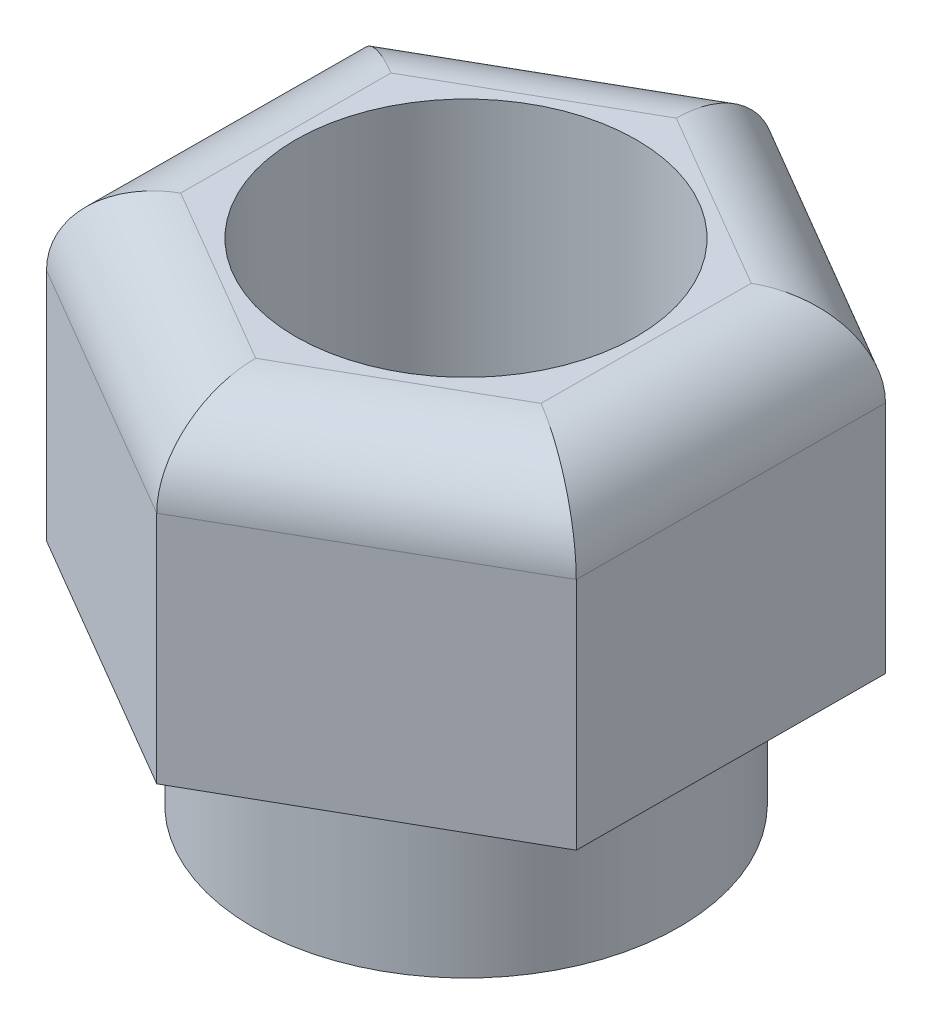
ISO-10303-21;
HEADER;
FILE_DESCRIPTION(('STEP AP214'),'2;1');
FILE_NAME('part.step','',(''),(''),'','','');
FILE_SCHEMA(('AUTOMOTIVE_DESIGN { 1 0 10303 214 1 1 1 1 }'));
ENDSEC;
DATA;
#1=APPLICATION_CONTEXT('core data for automotive mechanical design processes');
#2=APPLICATION_PROTOCOL_DEFINITION('international standard','automotive_design',2000,#1);
#3=PRODUCT_CONTEXT('',#1,'mechanical');
#4=PRODUCT('Part','Part','',(#3));
#5=PRODUCT_RELATED_PRODUCT_CATEGORY('part','',(#4));
#6=PRODUCT_DEFINITION_FORMATION('','',#4);
#7=PRODUCT_DEFINITION_CONTEXT('part definition',#1,'design');
#8=PRODUCT_DEFINITION('design','',#6,#7);
#9=PRODUCT_DEFINITION_SHAPE('','',#8);
#10=(LENGTH_UNIT() NAMED_UNIT(*) SI_UNIT(.MILLI.,.METRE.));
#11=(NAMED_UNIT(*) PLANE_ANGLE_UNIT() SI_UNIT($,.RADIAN.));
#12=(NAMED_UNIT(*) SI_UNIT($,.STERADIAN.) SOLID_ANGLE_UNIT());
#13=UNCERTAINTY_MEASURE_WITH_UNIT(LENGTH_MEASURE(1.E-05),#10,'distance_accuracy_value','');
#14=(GEOMETRIC_REPRESENTATION_CONTEXT(3) GLOBAL_UNCERTAINTY_ASSIGNED_CONTEXT((#13)) GLOBAL_UNIT_ASSIGNED_CONTEXT((#10,
#11,#12)) REPRESENTATION_CONTEXT('',''));
#15=CARTESIAN_POINT('',(0.,0.,0.));
#16=DIRECTION('',(0.,0.,1.));
#17=DIRECTION('',(1.,0.,0.));
#18=AXIS2_PLACEMENT_3D('',#15,#16,#17);
#19=CARTESIAN_POINT('',(0.,8.,0.));
#20=DIRECTION('',(0.,-1.,0.));
#21=DIRECTION('',(0.,0.,-1.));
#22=AXIS2_PLACEMENT_3D('',#19,#20,#21);
#23=CYLINDRICAL_SURFACE('',#22,10.);
#24=CARTESIAN_POINT('',(0.,8.,0.));
#25=DIRECTION('',(0.,1.,0.));
#26=DIRECTION('',(0.,0.,1.));
#27=AXIS2_PLACEMENT_3D('',#24,#25,#26);
#28=CIRCLE('',#27,10.);
#29=CARTESIAN_POINT('',(0.,8.,10.));
#30=VERTEX_POINT('',#29);
#31=EDGE_CURVE('E150',#30,#30,#28,.T.);
#32=ORIENTED_EDGE('',*,*,#31,.F.);
#33=EDGE_LOOP('',(#32));
#34=FACE_BOUND('',#33,.T.);
#35=CARTESIAN_POINT('',(0.,0.,0.));
#36=DIRECTION('',(0.,1.,0.));
#37=DIRECTION('',(0.,0.,1.));
#38=AXIS2_PLACEMENT_3D('',#35,#36,#37);
#39=CIRCLE('',#38,10.);
#40=CARTESIAN_POINT('',(0.,0.,10.));
#41=VERTEX_POINT('',#40);
#42=EDGE_CURVE('E110',#41,#41,#39,.T.);
#43=ORIENTED_EDGE('',*,*,#42,.T.);
#44=EDGE_LOOP('',(#43));
#45=FACE_BOUND('',#44,.T.);
#46=ADVANCED_FACE('F32',(#34,#45),#23,.T.);
#47=CARTESIAN_POINT('',(0.,0.,0.));
#48=DIRECTION('',(0.,1.,0.));
#49=DIRECTION('',(0.,0.,1.));
#50=AXIS2_PLACEMENT_3D('',#47,#48,#49);
#51=PLANE('',#50);
#52=CARTESIAN_POINT('',(0.,0.,0.));
#53=DIRECTION('',(0.,-1.,0.));
#54=DIRECTION('',(0.,0.,-1.));
#55=AXIS2_PLACEMENT_3D('',#52,#53,#54);
#56=CIRCLE('',#55,8.);
#57=CARTESIAN_POINT('',(0.,0.,-8.));
#58=VERTEX_POINT('',#57);
#59=EDGE_CURVE('E126',#58,#58,#56,.T.);
#60=ORIENTED_EDGE('',*,*,#59,.F.);
#61=EDGE_LOOP('',(#60));
#62=FACE_BOUND('',#61,.T.);
#63=ORIENTED_EDGE('',*,*,#42,.F.);
#64=EDGE_LOOP('',(#63));
#65=FACE_BOUND('',#64,.T.);
#66=ADVANCED_FACE('F207',(#62,#65),#51,.F.);
#67=CARTESIAN_POINT('',(-0.0794251265189853,23.,14.4335382004071));
#68=DIRECTION('',(-0.495226922330687,0.,-0.868763659114995));
#69=DIRECTION('',(-0.868763659114995,0.,0.495226922330687));
#70=AXIS2_PLACEMENT_3D('',#67,#68,#69);
#71=PLANE('',#70);
#72=DIRECTION('',(0.,-1.,0.));
#73=VECTOR('',#72,1.);
#74=CARTESIAN_POINT('',(12.4600981847862,23.,7.28555327746779));
#75=LINE('',#74,#73);
#76=CARTESIAN_POINT('',(12.4600981847862,19.,7.28555327746779));
#77=VERTEX_POINT('',#76);
#78=CARTESIAN_POINT('',(12.4600981847862,8.,7.28555327746779));
#79=VERTEX_POINT('',#78);
#80=EDGE_CURVE('E102',#77,#79,#75,.T.);
#81=ORIENTED_EDGE('',*,*,#80,.F.);
#82=DIRECTION('',(0.868763659114995,0.,-0.495226922330687));
#83=VECTOR('',#82,1.);
#84=CARTESIAN_POINT('',(-0.0794251265189874,19.,14.4335382004071));
#85=LINE('',#84,#83);
#86=CARTESIAN_POINT('',(-0.0794251265189853,19.,14.4335382004071));
#87=VERTEX_POINT('',#86);
#88=EDGE_CURVE('E11',#77,#87,#85,.F.);
#89=ORIENTED_EDGE('',*,*,#88,.T.);
#90=DIRECTION('',(0.,-1.,0.));
#91=VECTOR('',#90,1.);
#92=CARTESIAN_POINT('',(-0.0794251265189853,23.,14.4335382004071));
#93=LINE('',#92,#91);
#94=CARTESIAN_POINT('',(-0.0794251265189853,8.,14.4335382004071));
#95=VERTEX_POINT('',#94);
#96=EDGE_CURVE('E124',#87,#95,#93,.T.);
#97=ORIENTED_EDGE('',*,*,#96,.T.);
#98=DIRECTION('',(0.868763659114995,0.,-0.495226922330687));
#99=VECTOR('',#98,1.);
#100=CARTESIAN_POINT('',(-0.0794251265189853,8.,14.4335382004071));
#101=LINE('',#100,#99);
#102=EDGE_CURVE('E117',#95,#79,#101,.T.);
#103=ORIENTED_EDGE('',*,*,#102,.T.);
#104=EDGE_LOOP('',(#81,#89,#97,#103));
#105=FACE_BOUND('',#104,.T.);
#106=ADVANCED_FACE('F122',(#105),#71,.F.);
#107=CARTESIAN_POINT('',(12.4600981847862,23.,7.28555327746779));
#108=DIRECTION('',(-0.999984859843654,0.,-0.00550273418113889));
#109=DIRECTION('',(-0.00550273418113889,0.,0.999984859843654));
#110=AXIS2_PLACEMENT_3D('',#107,#108,#109);
#111=PLANE('',#110);
#112=DIRECTION('',(0.,-1.,0.));
#113=VECTOR('',#112,1.);
#114=CARTESIAN_POINT('',(12.5395233113052,23.,-7.14798492293931));
#115=LINE('',#114,#113);
#116=CARTESIAN_POINT('',(12.5395233113052,19.,-7.14798492293931));
#117=VERTEX_POINT('',#116);
#118=CARTESIAN_POINT('',(12.5395233113052,8.,-7.14798492293931));
#119=VERTEX_POINT('',#118);
#120=EDGE_CURVE('E111',#117,#119,#115,.T.);
#121=ORIENTED_EDGE('',*,*,#120,.F.);
#122=DIRECTION('',(0.00550273418113889,0.,-0.999984859843654));
#123=VECTOR('',#122,1.);
#124=CARTESIAN_POINT('',(12.4600981847862,19.,7.28555327746779));
#125=LINE('',#124,#123);
#126=EDGE_CURVE('E41',#117,#77,#125,.F.);
#127=ORIENTED_EDGE('',*,*,#126,.T.);
#128=ORIENTED_EDGE('',*,*,#80,.T.);
#129=DIRECTION('',(0.00550273418113889,0.,-0.999984859843654));
#130=VECTOR('',#129,1.);
#131=CARTESIAN_POINT('',(12.4600981847862,8.,7.28555327746779));
#132=LINE('',#131,#130);
#133=EDGE_CURVE('E105',#79,#119,#132,.T.);
#134=ORIENTED_EDGE('',*,*,#133,.T.);
#135=EDGE_LOOP('',(#121,#127,#128,#134));
#136=FACE_BOUND('',#135,.T.);
#137=ADVANCED_FACE('F104',(#136),#111,.F.);
#138=CARTESIAN_POINT('',(12.5395233113052,23.,-7.14798492293931));
#139=DIRECTION('',(-0.504757937512966,0.,0.863260924933856));
#140=DIRECTION('',(0.863260924933856,0.,0.504757937512966));
#141=AXIS2_PLACEMENT_3D('',#138,#139,#140);
#142=PLANE('',#141);
#143=DIRECTION('',(0.,-1.,0.));
#144=VECTOR('',#143,1.);
#145=CARTESIAN_POINT('',(0.0794251265189895,23.,-14.4335382004071));
#146=LINE('',#145,#144);
#147=CARTESIAN_POINT('',(0.0794251265189895,19.,-14.4335382004071));
#148=VERTEX_POINT('',#147);
#149=CARTESIAN_POINT('',(0.0794251265189895,8.,-14.4335382004071));
#150=VERTEX_POINT('',#149);
#151=EDGE_CURVE('E147',#148,#150,#146,.T.);
#152=ORIENTED_EDGE('',*,*,#151,.F.);
#153=DIRECTION('',(-0.863260924933856,0.,-0.504757937512966));
#154=VECTOR('',#153,1.);
#155=CARTESIAN_POINT('',(12.5395233113052,19.,-7.1479849229393));
#156=LINE('',#155,#154);
#157=EDGE_CURVE('E56',#148,#117,#156,.F.);
#158=ORIENTED_EDGE('',*,*,#157,.T.);
#159=ORIENTED_EDGE('',*,*,#120,.T.);
#160=DIRECTION('',(-0.863260924933856,0.,-0.504757937512966));
#161=VECTOR('',#160,1.);
#162=CARTESIAN_POINT('',(12.5395233113052,8.,-7.14798492293931));
#163=LINE('',#162,#161);
#164=EDGE_CURVE('E120',#119,#150,#163,.T.);
#165=ORIENTED_EDGE('',*,*,#164,.T.);
#166=EDGE_LOOP('',(#152,#158,#159,#165));
#167=FACE_BOUND('',#166,.T.);
#168=ADVANCED_FACE('F277',(#167),#142,.F.);
#169=CARTESIAN_POINT('',(0.0794251265189895,23.,-14.4335382004071));
#170=DIRECTION('',(0.495226922330687,0.,0.868763659114995));
#171=DIRECTION('',(0.868763659114995,0.,-0.495226922330687));
#172=AXIS2_PLACEMENT_3D('',#169,#170,#171);
#173=PLANE('',#172);
#174=DIRECTION('',(0.,-1.,0.));
#175=VECTOR('',#174,1.);
#176=CARTESIAN_POINT('',(-12.4600981847862,23.,-7.28555327746779));
#177=LINE('',#176,#175);
#178=CARTESIAN_POINT('',(-12.4600981847862,19.,-7.28555327746779));
#179=VERTEX_POINT('',#178);
#180=CARTESIAN_POINT('',(-12.4600981847862,8.,-7.28555327746779));
#181=VERTEX_POINT('',#180);
#182=EDGE_CURVE('E145',#179,#181,#177,.T.);
#183=ORIENTED_EDGE('',*,*,#182,.F.);
#184=DIRECTION('',(-0.868763659114995,0.,0.495226922330687));
#185=VECTOR('',#184,1.);
#186=CARTESIAN_POINT('',(0.0794251265189898,19.,-14.4335382004071));
#187=LINE('',#186,#185);
#188=EDGE_CURVE('E173',#179,#148,#187,.F.);
#189=ORIENTED_EDGE('',*,*,#188,.T.);
#190=ORIENTED_EDGE('',*,*,#151,.T.);
#191=DIRECTION('',(-0.868763659114995,0.,0.495226922330687));
#192=VECTOR('',#191,1.);
#193=CARTESIAN_POINT('',(0.0794251265189895,8.,-14.4335382004071));
#194=LINE('',#193,#192);
#195=EDGE_CURVE('E134',#150,#181,#194,.T.);
#196=ORIENTED_EDGE('',*,*,#195,.T.);
#197=EDGE_LOOP('',(#183,#189,#190,#196));
#198=FACE_BOUND('',#197,.T.);
#199=ADVANCED_FACE('F260',(#198),#173,.F.);
#200=CARTESIAN_POINT('',(-12.4600981847862,23.,-7.28555327746779));
#201=DIRECTION('',(0.999984859843654,0.,0.005502734181139));
#202=DIRECTION('',(0.00550273418113901,0.,-0.999984859843654));
#203=AXIS2_PLACEMENT_3D('',#200,#201,#202);
#204=PLANE('',#203);
#205=DIRECTION('',(0.,-1.,0.));
#206=VECTOR('',#205,1.);
#207=CARTESIAN_POINT('',(-12.5395233113052,23.,7.14798492293931));
#208=LINE('',#207,#206);
#209=CARTESIAN_POINT('',(-12.5395233113052,19.,7.14798492293931));
#210=VERTEX_POINT('',#209);
#211=CARTESIAN_POINT('',(-12.5395233113052,8.,7.14798492293931));
#212=VERTEX_POINT('',#211);
#213=EDGE_CURVE('E143',#210,#212,#208,.T.);
#214=ORIENTED_EDGE('',*,*,#213,.F.);
#215=DIRECTION('',(-0.00550273418113901,0.,0.999984859843654));
#216=VECTOR('',#215,1.);
#217=CARTESIAN_POINT('',(-12.4600981847862,19.,-7.28555327746779));
#218=LINE('',#217,#216);
#219=EDGE_CURVE('E171',#210,#179,#218,.F.);
#220=ORIENTED_EDGE('',*,*,#219,.T.);
#221=ORIENTED_EDGE('',*,*,#182,.T.);
#222=DIRECTION('',(-0.00550273418113901,0.,0.999984859843654));
#223=VECTOR('',#222,1.);
#224=CARTESIAN_POINT('',(-12.4600981847862,8.,-7.28555327746779));
#225=LINE('',#224,#223);
#226=EDGE_CURVE('E137',#181,#212,#225,.T.);
#227=ORIENTED_EDGE('',*,*,#226,.T.);
#228=EDGE_LOOP('',(#214,#220,#221,#227));
#229=FACE_BOUND('',#228,.T.);
#230=ADVANCED_FACE('F258',(#229),#204,.F.);
#231=CARTESIAN_POINT('',(-12.5395233113052,23.,7.14798492293931));
#232=DIRECTION('',(0.504757937512966,0.,-0.863260924933856));
#233=DIRECTION('',(-0.863260924933856,0.,-0.504757937512966));
#234=AXIS2_PLACEMENT_3D('',#231,#232,#233);
#235=PLANE('',#234);
#236=ORIENTED_EDGE('',*,*,#96,.F.);
#237=DIRECTION('',(0.863260924933856,0.,0.504757937512966));
#238=VECTOR('',#237,1.);
#239=CARTESIAN_POINT('',(-12.5395233113052,19.,7.14798492293931));
#240=LINE('',#239,#238);
#241=EDGE_CURVE('E168',#87,#210,#240,.F.);
#242=ORIENTED_EDGE('',*,*,#241,.T.);
#243=ORIENTED_EDGE('',*,*,#213,.T.);
#244=DIRECTION('',(0.863260924933856,0.,0.504757937512966));
#245=VECTOR('',#244,1.);
#246=CARTESIAN_POINT('',(-12.5395233113052,8.,7.14798492293931));
#247=LINE('',#246,#245);
#248=EDGE_CURVE('E140',#212,#95,#247,.T.);
#249=ORIENTED_EDGE('',*,*,#248,.T.);
#250=EDGE_LOOP('',(#236,#242,#243,#249));
#251=FACE_BOUND('',#250,.T.);
#252=ADVANCED_FACE('F249',(#251),#235,.F.);
#253=CARTESIAN_POINT('',(0.,23.,0.));
#254=DIRECTION('',(0.,1.,0.));
#255=DIRECTION('',(0.,0.,1.));
#256=AXIS2_PLACEMENT_3D('',#253,#254,#255);
#257=PLANE('',#256);
#258=DIRECTION('',(-0.00550273418113901,0.,0.999984859843654));
#259=VECTOR('',#258,1.);
#260=CARTESIAN_POINT('',(-8.53958387193055,23.,7.16999585966386));
#261=LINE('',#260,#259);
#262=CARTESIAN_POINT('',(-8.4728667656546,23.,-4.9541762286781));
#263=VERTEX_POINT('',#262);
#264=CARTESIAN_POINT('',(-8.52687585168751,23.,4.86062974759873));
#265=VERTEX_POINT('',#264);
#266=EDGE_CURVE('E163',#263,#265,#261,.T.);
#267=ORIENTED_EDGE('',*,*,#266,.T.);
#268=DIRECTION('',(0.863260924933856,0.,0.504757937512966));
#269=VECTOR('',#268,1.);
#270=CARTESIAN_POINT('',(1.93960662353288,23.,10.9804945006717));
#271=LINE('',#270,#269);
#272=CARTESIAN_POINT('',(-0.0540090860329087,23.,9.81480597627682));
#273=VERTEX_POINT('',#272);
#274=EDGE_CURVE('E165',#265,#273,#271,.T.);
#275=ORIENTED_EDGE('',*,*,#274,.T.);
#276=DIRECTION('',(0.868763659114995,0.,-0.495226922330687));
#277=VECTOR('',#276,1.);
#278=CARTESIAN_POINT('',(10.4791904954634,23.,3.81049864100781));
#279=LINE('',#278,#277);
#280=CARTESIAN_POINT('',(8.4728667656546,23.,4.9541762286781));
#281=VERTEX_POINT('',#280);
#282=EDGE_CURVE('E153',#273,#281,#279,.T.);
#283=ORIENTED_EDGE('',*,*,#282,.T.);
#284=DIRECTION('',(0.00550273418113889,0.,-0.999984859843654));
#285=VECTOR('',#284,1.);
#286=CARTESIAN_POINT('',(8.53958387193055,23.,-7.16999585966386));
#287=LINE('',#286,#285);
#288=CARTESIAN_POINT('',(8.52687585168751,23.,-4.86062974759873));
#289=VERTEX_POINT('',#288);
#290=EDGE_CURVE('E157',#281,#289,#287,.T.);
#291=ORIENTED_EDGE('',*,*,#290,.T.);
#292=DIRECTION('',(-0.863260924933856,0.,-0.504757937512966));
#293=VECTOR('',#292,1.);
#294=CARTESIAN_POINT('',(-1.93960662353288,23.,-10.9804945006717));
#295=LINE('',#294,#293);
#296=CARTESIAN_POINT('',(0.0540090860329129,23.,-9.81480597627682));
#297=VERTEX_POINT('',#296);
#298=EDGE_CURVE('E159',#289,#297,#295,.T.);
#299=ORIENTED_EDGE('',*,*,#298,.T.);
#300=DIRECTION('',(-0.868763659114995,0.,0.495226922330687));
#301=VECTOR('',#300,1.);
#302=CARTESIAN_POINT('',(-10.4791904954634,23.,-3.81049864100781));
#303=LINE('',#302,#301);
#304=EDGE_CURVE('E161',#297,#263,#303,.T.);
#305=ORIENTED_EDGE('',*,*,#304,.T.);
#306=EDGE_LOOP('',(#267,#275,#283,#291,#299,#305));
#307=FACE_BOUND('',#306,.T.);
#308=CARTESIAN_POINT('',(0.,23.,0.));
#309=DIRECTION('',(0.,1.,0.));
#310=DIRECTION('',(0.,0.,1.));
#311=AXIS2_PLACEMENT_3D('',#308,#309,#310);
#312=CIRCLE('',#311,8.);
#313=CARTESIAN_POINT('',(0.,23.,8.));
#314=VERTEX_POINT('',#313);
#315=EDGE_CURVE('E129',#314,#314,#312,.F.);
#316=ORIENTED_EDGE('',*,*,#315,.T.);
#317=EDGE_LOOP('',(#316));
#318=FACE_BOUND('',#317,.T.);
#319=ADVANCED_FACE('F199',(#307,#318),#257,.T.);
#320=CARTESIAN_POINT('',(0.,8.,0.));
#321=DIRECTION('',(0.,1.,0.));
#322=DIRECTION('',(0.,0.,1.));
#323=AXIS2_PLACEMENT_3D('',#320,#321,#322);
#324=PLANE('',#323);
#325=ORIENTED_EDGE('',*,*,#31,.T.);
#326=EDGE_LOOP('',(#325));
#327=FACE_BOUND('',#326,.T.);
#328=ORIENTED_EDGE('',*,*,#102,.F.);
#329=ORIENTED_EDGE('',*,*,#248,.F.);
#330=ORIENTED_EDGE('',*,*,#226,.F.);
#331=ORIENTED_EDGE('',*,*,#195,.F.);
#332=ORIENTED_EDGE('',*,*,#164,.F.);
#333=ORIENTED_EDGE('',*,*,#133,.F.);
#334=EDGE_LOOP('',(#328,#329,#330,#331,#332,#333));
#335=FACE_BOUND('',#334,.T.);
#336=ADVANCED_FACE('F115',(#327,#335),#324,.F.);
#337=CARTESIAN_POINT('',(0.,23.001,0.));
#338=DIRECTION('',(0.,-1.,0.));
#339=DIRECTION('',(0.,0.,-1.));
#340=AXIS2_PLACEMENT_3D('',#337,#338,#339);
#341=CYLINDRICAL_SURFACE('',#340,8.);
#342=ORIENTED_EDGE('',*,*,#315,.F.);
#343=EDGE_LOOP('',(#342));
#344=FACE_BOUND('',#343,.T.);
#345=ORIENTED_EDGE('',*,*,#59,.T.);
#346=EDGE_LOOP('',(#345));
#347=FACE_BOUND('',#346,.T.);
#348=ADVANCED_FACE('F201',(#344,#347),#341,.F.);
#349=CARTESIAN_POINT('',(4.29044246886021,19.,-7.33771786193778));
#350=DIRECTION('',(0.863260924933856,0.,0.504757937512966));
#351=DIRECTION('',(0.504757937512966,0.,-0.863260924933856));
#352=AXIS2_PLACEMENT_3D('',#349,#350,#351);
#353=CYLINDRICAL_SURFACE('',#352,4.);
#354=CARTESIAN_POINT('',(8.52687585168752,19.,-4.86062974759873));
#355=DIRECTION('',(0.495226922330687,0.,0.868763659114995));
#356=DIRECTION('',(-0.868763659114995,0.,0.495226922330687));
#357=AXIS2_PLACEMENT_3D('',#354,#355,#356);
#358=ELLIPSE('',#357,4.61880215351701,4.);
#359=EDGE_CURVE('E186',#117,#289,#358,.T.);
#360=ORIENTED_EDGE('',*,*,#359,.F.);
#361=ORIENTED_EDGE('',*,*,#157,.F.);
#362=CARTESIAN_POINT('',(0.0540090860329133,19.,-9.81480597627682));
#363=DIRECTION('',(0.999984859843654,0.,0.00550273418113922));
#364=DIRECTION('',(-0.005502734181139,0.,0.999984859843654));
#365=AXIS2_PLACEMENT_3D('',#362,#363,#364);
#366=ELLIPSE('',#365,4.61880215351701,4.);
#367=EDGE_CURVE('E36',#297,#148,#366,.F.);
#368=ORIENTED_EDGE('',*,*,#367,.F.);
#369=ORIENTED_EDGE('',*,*,#298,.F.);
#370=EDGE_LOOP('',(#360,#361,#368,#369));
#371=FACE_BOUND('',#370,.T.);
#372=ADVANCED_FACE('F34',(#371),#353,.T.);
#373=CARTESIAN_POINT('',(-4.20942883981084,19.,-7.38449110247746));
#374=DIRECTION('',(0.868763659114995,0.,-0.495226922330687));
#375=DIRECTION('',(-0.495226922330687,0.,-0.868763659114995));
#376=AXIS2_PLACEMENT_3D('',#373,#374,#375);
#377=CYLINDRICAL_SURFACE('',#376,4.);
#378=ORIENTED_EDGE('',*,*,#367,.T.);
#379=ORIENTED_EDGE('',*,*,#188,.F.);
#380=CARTESIAN_POINT('',(-8.4728667656546,19.,-4.9541762286781));
#381=DIRECTION('',(0.504757937512966,0.,-0.863260924933856));
#382=DIRECTION('',(0.863260924933856,0.,0.504757937512966));
#383=AXIS2_PLACEMENT_3D('',#380,#381,#382);
#384=ELLIPSE('',#383,4.61880215351701,4.);
#385=EDGE_CURVE('E184',#263,#179,#384,.F.);
#386=ORIENTED_EDGE('',*,*,#385,.F.);
#387=ORIENTED_EDGE('',*,*,#304,.F.);
#388=EDGE_LOOP('',(#378,#379,#386,#387));
#389=FACE_BOUND('',#388,.T.);
#390=ADVANCED_FACE('F235',(#389),#377,.T.);
#391=CARTESIAN_POINT('',(8.49987130867106,19.,0.0467732405396805));
#392=DIRECTION('',(-0.00550273418113889,0.,0.999984859843654));
#393=DIRECTION('',(0.999984859843654,0.,0.00550273418113889));
#394=AXIS2_PLACEMENT_3D('',#391,#392,#393);
#395=CYLINDRICAL_SURFACE('',#394,4.);
#396=ORIENTED_EDGE('',*,*,#359,.T.);
#397=ORIENTED_EDGE('',*,*,#290,.F.);
#398=CARTESIAN_POINT('',(8.4728667656546,19.,4.9541762286781));
#399=DIRECTION('',(-0.504757937512966,0.,0.863260924933856));
#400=DIRECTION('',(-0.863260924933856,0.,-0.504757937512966));
#401=AXIS2_PLACEMENT_3D('',#398,#399,#400);
#402=ELLIPSE('',#401,4.61880215351701,4.);
#403=EDGE_CURVE('E181',#77,#281,#402,.T.);
#404=ORIENTED_EDGE('',*,*,#403,.F.);
#405=ORIENTED_EDGE('',*,*,#126,.F.);
#406=EDGE_LOOP('',(#396,#397,#404,#405));
#407=FACE_BOUND('',#406,.T.);
#408=ADVANCED_FACE('F232',(#407),#395,.T.);
#409=CARTESIAN_POINT('',(-8.49987130867106,19.,-0.0467732405396816));
#410=DIRECTION('',(0.00550273418113901,0.,-0.999984859843654));
#411=DIRECTION('',(-0.999984859843654,0.,-0.00550273418113901));
#412=AXIS2_PLACEMENT_3D('',#409,#410,#411);
#413=CYLINDRICAL_SURFACE('',#412,4.);
#414=ORIENTED_EDGE('',*,*,#385,.T.);
#415=ORIENTED_EDGE('',*,*,#219,.F.);
#416=CARTESIAN_POINT('',(-8.52687585168752,19.,4.86062974759873));
#417=DIRECTION('',(-0.495226922330687,0.,-0.868763659114995));
#418=DIRECTION('',(0.868763659114995,0.,-0.495226922330688));
#419=AXIS2_PLACEMENT_3D('',#416,#417,#418);
#420=ELLIPSE('',#419,4.61880215351701,4.);
#421=EDGE_CURVE('E179',#265,#210,#420,.F.);
#422=ORIENTED_EDGE('',*,*,#421,.F.);
#423=ORIENTED_EDGE('',*,*,#266,.F.);
#424=EDGE_LOOP('',(#414,#415,#422,#423));
#425=FACE_BOUND('',#424,.T.);
#426=ADVANCED_FACE('F228',(#425),#413,.T.);
#427=CARTESIAN_POINT('',(4.20942883981084,19.,7.38449110247746));
#428=DIRECTION('',(-0.868763659114995,0.,0.495226922330687));
#429=DIRECTION('',(0.495226922330687,0.,0.868763659114995));
#430=AXIS2_PLACEMENT_3D('',#427,#428,#429);
#431=CYLINDRICAL_SURFACE('',#430,4.);
#432=ORIENTED_EDGE('',*,*,#403,.T.);
#433=ORIENTED_EDGE('',*,*,#282,.F.);
#434=CARTESIAN_POINT('',(-0.0540090860329076,19.,9.81480597627682));
#435=DIRECTION('',(-0.999984859843654,0.,-0.00550273418113909));
#436=DIRECTION('',(-0.00550273418113922,0.,0.999984859843654));
#437=AXIS2_PLACEMENT_3D('',#434,#435,#436);
#438=ELLIPSE('',#437,4.61880215351701,4.);
#439=EDGE_CURVE('E177',#87,#273,#438,.T.);
#440=ORIENTED_EDGE('',*,*,#439,.F.);
#441=ORIENTED_EDGE('',*,*,#88,.F.);
#442=EDGE_LOOP('',(#432,#433,#440,#441));
#443=FACE_BOUND('',#442,.T.);
#444=ADVANCED_FACE('F224',(#443),#431,.T.);
#445=CARTESIAN_POINT('',(-4.29044246886021,19.,7.33771786193777));
#446=DIRECTION('',(-0.863260924933856,0.,-0.504757937512966));
#447=DIRECTION('',(-0.504757937512966,0.,0.863260924933856));
#448=AXIS2_PLACEMENT_3D('',#445,#446,#447);
#449=CYLINDRICAL_SURFACE('',#448,4.);
#450=ORIENTED_EDGE('',*,*,#421,.T.);
#451=ORIENTED_EDGE('',*,*,#241,.F.);
#452=ORIENTED_EDGE('',*,*,#439,.T.);
#453=ORIENTED_EDGE('',*,*,#274,.F.);
#454=EDGE_LOOP('',(#450,#451,#452,#453));
#455=FACE_BOUND('',#454,.T.);
#456=ADVANCED_FACE('F221',(#455),#449,.T.);
#457=CLOSED_SHELL('',(#46,#66,#106,#137,#168,#199,#230,#252,#319,#336,#348,#372,#390,#408,#426,
#444,#456));
#458=MANIFOLD_SOLID_BREP('B2',#457);
#459=ADVANCED_BREP_SHAPE_REPRESENTATION('',(#18,#458),#14);
#460=SHAPE_DEFINITION_REPRESENTATION(#9,#459);
ENDSEC;
END-ISO-10303-21;
